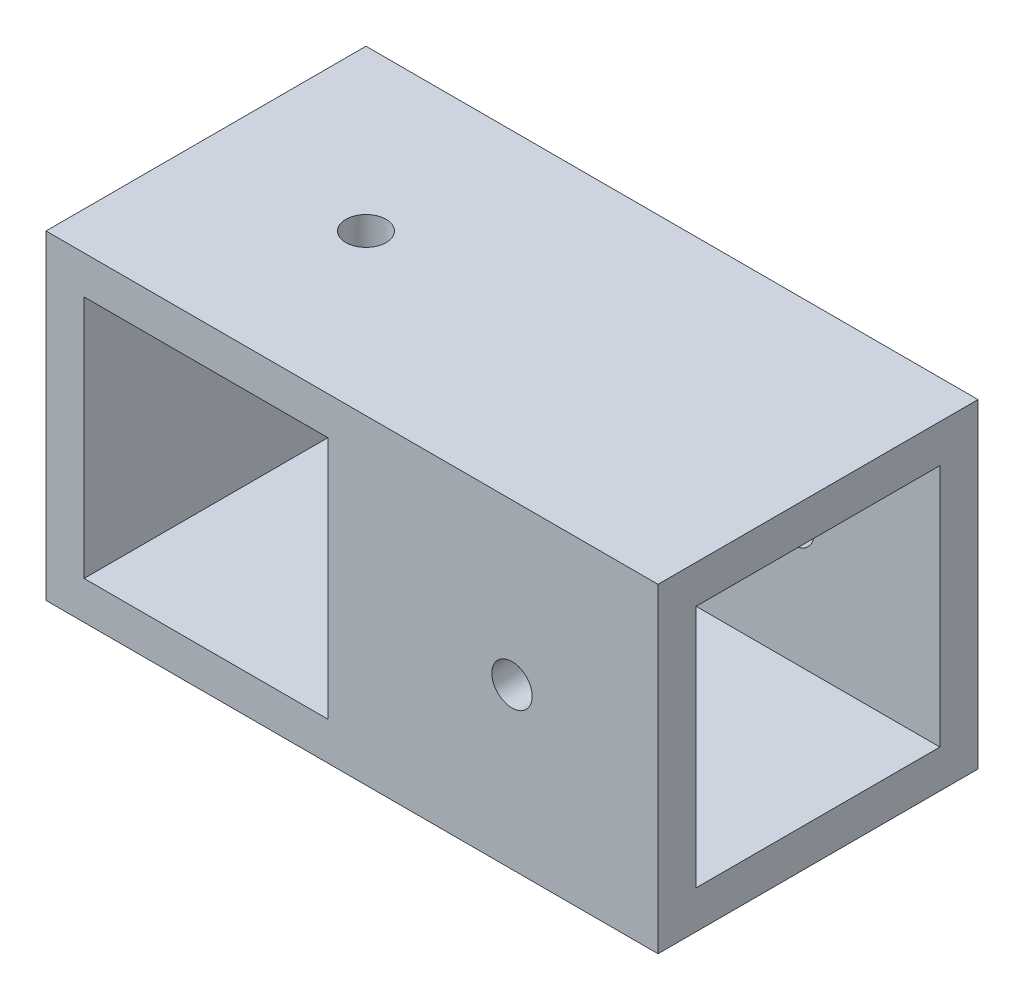
ISO-10303-21;
HEADER;
FILE_DESCRIPTION(('STEP AP214'),'2;1');
FILE_NAME('part.step','',(''),(''),'','','');
FILE_SCHEMA(('AUTOMOTIVE_DESIGN { 1 0 10303 214 1 1 1 1 }'));
ENDSEC;
DATA;
#1=APPLICATION_CONTEXT('core data for automotive mechanical design processes');
#2=APPLICATION_PROTOCOL_DEFINITION('international standard','automotive_design',2000,#1);
#3=PRODUCT_CONTEXT('',#1,'mechanical');
#4=PRODUCT('Part','Part','',(#3));
#5=PRODUCT_RELATED_PRODUCT_CATEGORY('part','',(#4));
#6=PRODUCT_DEFINITION_FORMATION('','',#4);
#7=PRODUCT_DEFINITION_CONTEXT('part definition',#1,'design');
#8=PRODUCT_DEFINITION('design','',#6,#7);
#9=PRODUCT_DEFINITION_SHAPE('','',#8);
#10=(LENGTH_UNIT() NAMED_UNIT(*) SI_UNIT(.MILLI.,.METRE.));
#11=(NAMED_UNIT(*) PLANE_ANGLE_UNIT() SI_UNIT($,.RADIAN.));
#12=(NAMED_UNIT(*) SI_UNIT($,.STERADIAN.) SOLID_ANGLE_UNIT());
#13=UNCERTAINTY_MEASURE_WITH_UNIT(LENGTH_MEASURE(1.E-05),#10,'distance_accuracy_value','');
#14=(GEOMETRIC_REPRESENTATION_CONTEXT(3) GLOBAL_UNCERTAINTY_ASSIGNED_CONTEXT((#13)) GLOBAL_UNIT_ASSIGNED_CONTEXT((#10,
#11,#12)) REPRESENTATION_CONTEXT('',''));
#15=CARTESIAN_POINT('',(0.,0.,0.));
#16=DIRECTION('',(0.,0.,1.));
#17=DIRECTION('',(1.,0.,0.));
#18=AXIS2_PLACEMENT_3D('',#15,#16,#17);
#19=CARTESIAN_POINT('',(0.,0.,25.2));
#20=DIRECTION('',(0.,0.,1.));
#21=DIRECTION('',(1.,0.,0.));
#22=AXIS2_PLACEMENT_3D('',#19,#20,#21);
#23=PLANE('',#22);
#24=CARTESIAN_POINT('',(24.1,0.,25.2));
#25=DIRECTION('',(0.,0.,1.));
#26=DIRECTION('',(1.,0.,0.));
#27=AXIS2_PLACEMENT_3D('',#24,#25,#26);
#28=CIRCLE('',#27,1.5875);
#29=CARTESIAN_POINT('',(25.6875,0.,25.2));
#30=VERTEX_POINT('',#29);
#31=EDGE_CURVE('E286',#30,#30,#28,.T.);
#32=ORIENTED_EDGE('',*,*,#31,.F.);
#33=EDGE_LOOP('',(#32));
#34=FACE_BOUND('',#33,.T.);
#35=DIRECTION('',(0.,-1.,0.));
#36=VECTOR('',#35,1.);
#37=CARTESIAN_POINT('',(-12.6,12.6,25.2));
#38=LINE('',#37,#36);
#39=CARTESIAN_POINT('',(-12.6,12.6,25.2));
#40=VERTEX_POINT('',#39);
#41=CARTESIAN_POINT('',(-12.6,-12.6,25.2));
#42=VERTEX_POINT('',#41);
#43=EDGE_CURVE('E243',#40,#42,#38,.T.);
#44=ORIENTED_EDGE('',*,*,#43,.T.);
#45=DIRECTION('',(1.,0.,0.));
#46=VECTOR('',#45,1.);
#47=CARTESIAN_POINT('',(-12.6,-12.6,25.2));
#48=LINE('',#47,#46);
#49=CARTESIAN_POINT('',(35.6,-12.6,25.2));
#50=VERTEX_POINT('',#49);
#51=EDGE_CURVE('E247',#42,#50,#48,.T.);
#52=ORIENTED_EDGE('',*,*,#51,.T.);
#53=DIRECTION('',(0.,-1.,0.));
#54=VECTOR('',#53,1.);
#55=CARTESIAN_POINT('',(35.6,12.6,25.2));
#56=LINE('',#55,#54);
#57=CARTESIAN_POINT('',(35.6,12.6,25.2));
#58=VERTEX_POINT('',#57);
#59=EDGE_CURVE('E150',#58,#50,#56,.T.);
#60=ORIENTED_EDGE('',*,*,#59,.F.);
#61=DIRECTION('',(-1.,0.,0.));
#62=VECTOR('',#61,1.);
#63=CARTESIAN_POINT('',(-12.6,12.6,25.2));
#64=LINE('',#63,#62);
#65=EDGE_CURVE('E251',#58,#40,#64,.T.);
#66=ORIENTED_EDGE('',*,*,#65,.T.);
#67=EDGE_LOOP('',(#44,#52,#60,#66));
#68=FACE_BOUND('',#67,.T.);
#69=DIRECTION('',(-1.,0.,0.));
#70=VECTOR('',#69,1.);
#71=CARTESIAN_POINT('',(-9.6,9.6,25.2));
#72=LINE('',#71,#70);
#73=CARTESIAN_POINT('',(9.6,9.6,25.2));
#74=VERTEX_POINT('',#73);
#75=CARTESIAN_POINT('',(-9.6,9.6,25.2));
#76=VERTEX_POINT('',#75);
#77=EDGE_CURVE('E205',#74,#76,#72,.T.);
#78=ORIENTED_EDGE('',*,*,#77,.F.);
#79=DIRECTION('',(0.,1.,0.));
#80=VECTOR('',#79,1.);
#81=CARTESIAN_POINT('',(9.6,9.6,25.2));
#82=LINE('',#81,#80);
#83=CARTESIAN_POINT('',(9.6,-9.6,25.2));
#84=VERTEX_POINT('',#83);
#85=EDGE_CURVE('E202',#84,#74,#82,.T.);
#86=ORIENTED_EDGE('',*,*,#85,.F.);
#87=DIRECTION('',(1.,0.,0.));
#88=VECTOR('',#87,1.);
#89=CARTESIAN_POINT('',(-9.6,-9.6,25.2));
#90=LINE('',#89,#88);
#91=CARTESIAN_POINT('',(-9.6,-9.6,25.2));
#92=VERTEX_POINT('',#91);
#93=EDGE_CURVE('E212',#92,#84,#90,.T.);
#94=ORIENTED_EDGE('',*,*,#93,.F.);
#95=DIRECTION('',(0.,-1.,0.));
#96=VECTOR('',#95,1.);
#97=CARTESIAN_POINT('',(-9.6,9.6,25.2));
#98=LINE('',#97,#96);
#99=EDGE_CURVE('E209',#76,#92,#98,.T.);
#100=ORIENTED_EDGE('',*,*,#99,.F.);
#101=EDGE_LOOP('',(#78,#86,#94,#100));
#102=FACE_BOUND('',#101,.T.);
#103=ADVANCED_FACE('F39',(#34,#68,#102),#23,.T.);
#104=CARTESIAN_POINT('',(0.,0.,0.));
#105=DIRECTION('',(0.,0.,1.));
#106=DIRECTION('',(1.,0.,0.));
#107=AXIS2_PLACEMENT_3D('',#104,#105,#106);
#108=PLANE('',#107);
#109=CARTESIAN_POINT('',(24.1,0.,0.));
#110=DIRECTION('',(0.,0.,1.));
#111=DIRECTION('',(1.,0.,0.));
#112=AXIS2_PLACEMENT_3D('',#109,#110,#111);
#113=CIRCLE('',#112,1.5875);
#114=CARTESIAN_POINT('',(25.6875,0.,0.));
#115=VERTEX_POINT('',#114);
#116=EDGE_CURVE('E290',#115,#115,#113,.T.);
#117=ORIENTED_EDGE('',*,*,#116,.T.);
#118=EDGE_LOOP('',(#117));
#119=FACE_BOUND('',#118,.T.);
#120=DIRECTION('',(0.,-1.,0.));
#121=VECTOR('',#120,1.);
#122=CARTESIAN_POINT('',(-12.6,12.6,0.));
#123=LINE('',#122,#121);
#124=CARTESIAN_POINT('',(-12.6,12.6,0.));
#125=VERTEX_POINT('',#124);
#126=CARTESIAN_POINT('',(-12.6,-12.6,0.));
#127=VERTEX_POINT('',#126);
#128=EDGE_CURVE('E242',#125,#127,#123,.T.);
#129=ORIENTED_EDGE('',*,*,#128,.F.);
#130=DIRECTION('',(-1.,0.,0.));
#131=VECTOR('',#130,1.);
#132=CARTESIAN_POINT('',(-12.6,12.6,0.));
#133=LINE('',#132,#131);
#134=CARTESIAN_POINT('',(35.6,12.6,0.));
#135=VERTEX_POINT('',#134);
#136=EDGE_CURVE('E248',#135,#125,#133,.T.);
#137=ORIENTED_EDGE('',*,*,#136,.F.);
#138=DIRECTION('',(0.,1.,0.));
#139=VECTOR('',#138,1.);
#140=CARTESIAN_POINT('',(35.6,12.6,0.));
#141=LINE('',#140,#139);
#142=CARTESIAN_POINT('',(35.6,-12.6,0.));
#143=VERTEX_POINT('',#142);
#144=EDGE_CURVE('E193',#143,#135,#141,.T.);
#145=ORIENTED_EDGE('',*,*,#144,.F.);
#146=DIRECTION('',(1.,0.,0.));
#147=VECTOR('',#146,1.);
#148=CARTESIAN_POINT('',(-12.6,-12.6,0.));
#149=LINE('',#148,#147);
#150=EDGE_CURVE('E257',#127,#143,#149,.T.);
#151=ORIENTED_EDGE('',*,*,#150,.F.);
#152=EDGE_LOOP('',(#129,#137,#145,#151));
#153=FACE_BOUND('',#152,.T.);
#154=DIRECTION('',(0.,1.,0.));
#155=VECTOR('',#154,1.);
#156=CARTESIAN_POINT('',(9.6,9.6,0.));
#157=LINE('',#156,#155);
#158=CARTESIAN_POINT('',(9.6,-9.6,0.));
#159=VERTEX_POINT('',#158);
#160=CARTESIAN_POINT('',(9.6,9.6,0.));
#161=VERTEX_POINT('',#160);
#162=EDGE_CURVE('E201',#159,#161,#157,.T.);
#163=ORIENTED_EDGE('',*,*,#162,.T.);
#164=DIRECTION('',(-1.,0.,0.));
#165=VECTOR('',#164,1.);
#166=CARTESIAN_POINT('',(-9.6,9.6,0.));
#167=LINE('',#166,#165);
#168=CARTESIAN_POINT('',(-9.6,9.6,0.));
#169=VERTEX_POINT('',#168);
#170=EDGE_CURVE('E219',#161,#169,#167,.T.);
#171=ORIENTED_EDGE('',*,*,#170,.T.);
#172=DIRECTION('',(0.,-1.,0.));
#173=VECTOR('',#172,1.);
#174=CARTESIAN_POINT('',(-9.6,9.6,0.));
#175=LINE('',#174,#173);
#176=CARTESIAN_POINT('',(-9.6,-9.6,0.));
#177=VERTEX_POINT('',#176);
#178=EDGE_CURVE('E223',#169,#177,#175,.T.);
#179=ORIENTED_EDGE('',*,*,#178,.T.);
#180=DIRECTION('',(1.,0.,0.));
#181=VECTOR('',#180,1.);
#182=CARTESIAN_POINT('',(-9.6,-9.6,0.));
#183=LINE('',#182,#181);
#184=EDGE_CURVE('E206',#177,#159,#183,.T.);
#185=ORIENTED_EDGE('',*,*,#184,.T.);
#186=EDGE_LOOP('',(#163,#171,#179,#185));
#187=FACE_BOUND('',#186,.T.);
#188=ADVANCED_FACE('F295',(#119,#153,#187),#108,.F.);
#189=CARTESIAN_POINT('',(-12.6,12.6,25.2));
#190=DIRECTION('',(1.,0.,0.));
#191=DIRECTION('',(0.,1.,0.));
#192=AXIS2_PLACEMENT_3D('',#189,#190,#191);
#193=PLANE('',#192);
#194=ORIENTED_EDGE('',*,*,#128,.T.);
#195=DIRECTION('',(0.,0.,-1.));
#196=VECTOR('',#195,1.);
#197=CARTESIAN_POINT('',(-12.6,-12.6,25.2));
#198=LINE('',#197,#196);
#199=EDGE_CURVE('E11',#42,#127,#198,.T.);
#200=ORIENTED_EDGE('',*,*,#199,.F.);
#201=ORIENTED_EDGE('',*,*,#43,.F.);
#202=DIRECTION('',(0.,0.,-1.));
#203=VECTOR('',#202,1.);
#204=CARTESIAN_POINT('',(-12.6,12.6,25.2));
#205=LINE('',#204,#203);
#206=EDGE_CURVE('E49',#40,#125,#205,.T.);
#207=ORIENTED_EDGE('',*,*,#206,.T.);
#208=EDGE_LOOP('',(#194,#200,#201,#207));
#209=FACE_BOUND('',#208,.T.);
#210=ADVANCED_FACE('F41',(#209),#193,.F.);
#211=CARTESIAN_POINT('',(-12.6,-12.6,25.2));
#212=DIRECTION('',(0.,1.,0.));
#213=DIRECTION('',(-1.,0.,0.));
#214=AXIS2_PLACEMENT_3D('',#211,#212,#213);
#215=PLANE('',#214);
#216=CARTESIAN_POINT('',(0.,-12.6,12.6));
#217=DIRECTION('',(0.,1.,0.));
#218=DIRECTION('',(0.,0.,1.));
#219=AXIS2_PLACEMENT_3D('',#216,#217,#218);
#220=CIRCLE('',#219,1.5875);
#221=CARTESIAN_POINT('',(0.,-12.6,14.1875));
#222=VERTEX_POINT('',#221);
#223=EDGE_CURVE('E267',#222,#222,#220,.T.);
#224=ORIENTED_EDGE('',*,*,#223,.T.);
#225=EDGE_LOOP('',(#224));
#226=FACE_BOUND('',#225,.T.);
#227=ORIENTED_EDGE('',*,*,#150,.T.);
#228=DIRECTION('',(0.,0.,-1.));
#229=VECTOR('',#228,1.);
#230=CARTESIAN_POINT('',(35.6,-12.6,25.2));
#231=LINE('',#230,#229);
#232=EDGE_CURVE('E189',#50,#143,#231,.T.);
#233=ORIENTED_EDGE('',*,*,#232,.F.);
#234=ORIENTED_EDGE('',*,*,#51,.F.);
#235=ORIENTED_EDGE('',*,*,#199,.T.);
#236=EDGE_LOOP('',(#227,#233,#234,#235));
#237=FACE_BOUND('',#236,.T.);
#238=ADVANCED_FACE('F329',(#226,#237),#215,.F.);
#239=CARTESIAN_POINT('',(-12.6,12.6,25.2));
#240=DIRECTION('',(0.,-1.,0.));
#241=DIRECTION('',(0.,0.,-1.));
#242=AXIS2_PLACEMENT_3D('',#239,#240,#241);
#243=PLANE('',#242);
#244=CARTESIAN_POINT('',(0.,12.6,12.6));
#245=DIRECTION('',(0.,1.,0.));
#246=DIRECTION('',(0.,0.,1.));
#247=AXIS2_PLACEMENT_3D('',#244,#245,#246);
#248=CIRCLE('',#247,1.5875);
#249=CARTESIAN_POINT('',(0.,12.6,14.1875));
#250=VERTEX_POINT('',#249);
#251=EDGE_CURVE('E274',#250,#250,#248,.T.);
#252=ORIENTED_EDGE('',*,*,#251,.F.);
#253=EDGE_LOOP('',(#252));
#254=FACE_BOUND('',#253,.T.);
#255=ORIENTED_EDGE('',*,*,#136,.T.);
#256=ORIENTED_EDGE('',*,*,#206,.F.);
#257=ORIENTED_EDGE('',*,*,#65,.F.);
#258=DIRECTION('',(0.,0.,1.));
#259=VECTOR('',#258,1.);
#260=CARTESIAN_POINT('',(35.6,12.6,25.2));
#261=LINE('',#260,#259);
#262=EDGE_CURVE('E197',#135,#58,#261,.T.);
#263=ORIENTED_EDGE('',*,*,#262,.F.);
#264=EDGE_LOOP('',(#255,#256,#257,#263));
#265=FACE_BOUND('',#264,.T.);
#266=ADVANCED_FACE('F326',(#254,#265),#243,.F.);
#267=CARTESIAN_POINT('',(9.6,9.6,25.2));
#268=DIRECTION('',(-1.,0.,0.));
#269=DIRECTION('',(0.,-1.,0.));
#270=AXIS2_PLACEMENT_3D('',#267,#268,#269);
#271=PLANE('',#270);
#272=ORIENTED_EDGE('',*,*,#162,.F.);
#273=DIRECTION('',(0.,0.,-1.));
#274=VECTOR('',#273,1.);
#275=CARTESIAN_POINT('',(9.6,-9.6,25.2));
#276=LINE('',#275,#274);
#277=EDGE_CURVE('E215',#84,#159,#276,.T.);
#278=ORIENTED_EDGE('',*,*,#277,.F.);
#279=ORIENTED_EDGE('',*,*,#85,.T.);
#280=DIRECTION('',(0.,0.,-1.));
#281=VECTOR('',#280,1.);
#282=CARTESIAN_POINT('',(9.6,9.6,25.2));
#283=LINE('',#282,#281);
#284=EDGE_CURVE('E238',#74,#161,#283,.T.);
#285=ORIENTED_EDGE('',*,*,#284,.T.);
#286=EDGE_LOOP('',(#272,#278,#279,#285));
#287=FACE_BOUND('',#286,.T.);
#288=ADVANCED_FACE('F323',(#287),#271,.T.);
#289=CARTESIAN_POINT('',(-9.6,9.6,25.2));
#290=DIRECTION('',(0.,-1.,0.));
#291=DIRECTION('',(0.,0.,-1.));
#292=AXIS2_PLACEMENT_3D('',#289,#290,#291);
#293=PLANE('',#292);
#294=CARTESIAN_POINT('',(0.,9.6,12.6));
#295=DIRECTION('',(0.,-1.,0.));
#296=DIRECTION('',(0.,0.,-1.));
#297=AXIS2_PLACEMENT_3D('',#294,#295,#296);
#298=CIRCLE('',#297,1.5875);
#299=CARTESIAN_POINT('',(0.,9.6,11.0125));
#300=VERTEX_POINT('',#299);
#301=EDGE_CURVE('E169',#300,#300,#298,.T.);
#302=ORIENTED_EDGE('',*,*,#301,.F.);
#303=EDGE_LOOP('',(#302));
#304=FACE_BOUND('',#303,.T.);
#305=ORIENTED_EDGE('',*,*,#170,.F.);
#306=ORIENTED_EDGE('',*,*,#284,.F.);
#307=ORIENTED_EDGE('',*,*,#77,.T.);
#308=DIRECTION('',(0.,0.,-1.));
#309=VECTOR('',#308,1.);
#310=CARTESIAN_POINT('',(-9.6,9.6,25.2));
#311=LINE('',#310,#309);
#312=EDGE_CURVE('E235',#76,#169,#311,.T.);
#313=ORIENTED_EDGE('',*,*,#312,.T.);
#314=EDGE_LOOP('',(#305,#306,#307,#313));
#315=FACE_BOUND('',#314,.T.);
#316=ADVANCED_FACE('F360',(#304,#315),#293,.T.);
#317=CARTESIAN_POINT('',(-9.6,9.6,25.2));
#318=DIRECTION('',(1.,0.,0.));
#319=DIRECTION('',(0.,1.,0.));
#320=AXIS2_PLACEMENT_3D('',#317,#318,#319);
#321=PLANE('',#320);
#322=ORIENTED_EDGE('',*,*,#178,.F.);
#323=ORIENTED_EDGE('',*,*,#312,.F.);
#324=ORIENTED_EDGE('',*,*,#99,.T.);
#325=DIRECTION('',(0.,0.,-1.));
#326=VECTOR('',#325,1.);
#327=CARTESIAN_POINT('',(-9.6,-9.6,25.2));
#328=LINE('',#327,#326);
#329=EDGE_CURVE('E65',#92,#177,#328,.T.);
#330=ORIENTED_EDGE('',*,*,#329,.T.);
#331=EDGE_LOOP('',(#322,#323,#324,#330));
#332=FACE_BOUND('',#331,.T.);
#333=ADVANCED_FACE('F363',(#332),#321,.T.);
#334=CARTESIAN_POINT('',(-9.6,-9.6,25.2));
#335=DIRECTION('',(0.,1.,0.));
#336=DIRECTION('',(0.,0.,1.));
#337=AXIS2_PLACEMENT_3D('',#334,#335,#336);
#338=PLANE('',#337);
#339=CARTESIAN_POINT('',(0.,-9.6,12.6));
#340=DIRECTION('',(0.,1.,0.));
#341=DIRECTION('',(0.,0.,1.));
#342=AXIS2_PLACEMENT_3D('',#339,#340,#341);
#343=CIRCLE('',#342,1.5875);
#344=CARTESIAN_POINT('',(0.,-9.6,14.1875));
#345=VERTEX_POINT('',#344);
#346=EDGE_CURVE('E264',#345,#345,#343,.T.);
#347=ORIENTED_EDGE('',*,*,#346,.F.);
#348=EDGE_LOOP('',(#347));
#349=FACE_BOUND('',#348,.T.);
#350=ORIENTED_EDGE('',*,*,#184,.F.);
#351=ORIENTED_EDGE('',*,*,#329,.F.);
#352=ORIENTED_EDGE('',*,*,#93,.T.);
#353=ORIENTED_EDGE('',*,*,#277,.T.);
#354=EDGE_LOOP('',(#350,#351,#352,#353));
#355=FACE_BOUND('',#354,.T.);
#356=ADVANCED_FACE('F366',(#349,#355),#338,.T.);
#357=CARTESIAN_POINT('',(35.6,0.,0.));
#358=DIRECTION('',(1.,0.,0.));
#359=DIRECTION('',(0.,0.,-1.));
#360=AXIS2_PLACEMENT_3D('',#357,#358,#359);
#361=PLANE('',#360);
#362=ORIENTED_EDGE('',*,*,#59,.T.);
#363=ORIENTED_EDGE('',*,*,#232,.T.);
#364=ORIENTED_EDGE('',*,*,#144,.T.);
#365=ORIENTED_EDGE('',*,*,#262,.T.);
#366=EDGE_LOOP('',(#362,#363,#364,#365));
#367=FACE_BOUND('',#366,.T.);
#368=DIRECTION('',(0.,-1.,0.));
#369=VECTOR('',#368,1.);
#370=CARTESIAN_POINT('',(35.6,9.6,22.2));
#371=LINE('',#370,#369);
#372=CARTESIAN_POINT('',(35.6,9.6,22.2));
#373=VERTEX_POINT('',#372);
#374=CARTESIAN_POINT('',(35.6,-9.6,22.2));
#375=VERTEX_POINT('',#374);
#376=EDGE_CURVE('E141',#373,#375,#371,.T.);
#377=ORIENTED_EDGE('',*,*,#376,.F.);
#378=DIRECTION('',(0.,0.,1.));
#379=VECTOR('',#378,1.);
#380=CARTESIAN_POINT('',(35.6,9.6,22.2));
#381=LINE('',#380,#379);
#382=CARTESIAN_POINT('',(35.6,9.6,3.));
#383=VERTEX_POINT('',#382);
#384=EDGE_CURVE('E132',#383,#373,#381,.T.);
#385=ORIENTED_EDGE('',*,*,#384,.F.);
#386=DIRECTION('',(0.,1.,0.));
#387=VECTOR('',#386,1.);
#388=CARTESIAN_POINT('',(35.6,9.6,3.));
#389=LINE('',#388,#387);
#390=CARTESIAN_POINT('',(35.6,-9.6,3.));
#391=VERTEX_POINT('',#390);
#392=EDGE_CURVE('E160',#391,#383,#389,.T.);
#393=ORIENTED_EDGE('',*,*,#392,.F.);
#394=DIRECTION('',(0.,0.,-1.));
#395=VECTOR('',#394,1.);
#396=CARTESIAN_POINT('',(35.6,-9.6,22.2));
#397=LINE('',#396,#395);
#398=EDGE_CURVE('E156',#375,#391,#397,.T.);
#399=ORIENTED_EDGE('',*,*,#398,.F.);
#400=EDGE_LOOP('',(#377,#385,#393,#399));
#401=FACE_BOUND('',#400,.T.);
#402=ADVANCED_FACE('F154',(#367,#401),#361,.T.);
#403=CARTESIAN_POINT('',(35.6,9.6,22.2));
#404=DIRECTION('',(0.,-1.,0.));
#405=DIRECTION('',(0.,0.,-1.));
#406=AXIS2_PLACEMENT_3D('',#403,#404,#405);
#407=PLANE('',#406);
#408=DIRECTION('',(0.,0.,1.));
#409=VECTOR('',#408,1.);
#410=CARTESIAN_POINT('',(12.6,9.6,22.2));
#411=LINE('',#410,#409);
#412=CARTESIAN_POINT('',(12.6,9.6,3.));
#413=VERTEX_POINT('',#412);
#414=CARTESIAN_POINT('',(12.6,9.6,22.2));
#415=VERTEX_POINT('',#414);
#416=EDGE_CURVE('E166',#413,#415,#411,.T.);
#417=ORIENTED_EDGE('',*,*,#416,.F.);
#418=DIRECTION('',(-1.,0.,0.));
#419=VECTOR('',#418,1.);
#420=CARTESIAN_POINT('',(35.6,9.6,3.));
#421=LINE('',#420,#419);
#422=EDGE_CURVE('E57',#383,#413,#421,.T.);
#423=ORIENTED_EDGE('',*,*,#422,.F.);
#424=ORIENTED_EDGE('',*,*,#384,.T.);
#425=DIRECTION('',(-1.,0.,0.));
#426=VECTOR('',#425,1.);
#427=CARTESIAN_POINT('',(35.6,9.6,22.2));
#428=LINE('',#427,#426);
#429=EDGE_CURVE('E135',#373,#415,#428,.T.);
#430=ORIENTED_EDGE('',*,*,#429,.T.);
#431=EDGE_LOOP('',(#417,#423,#424,#430));
#432=FACE_BOUND('',#431,.T.);
#433=ADVANCED_FACE('F134',(#432),#407,.T.);
#434=CARTESIAN_POINT('',(35.6,9.6,22.2));
#435=DIRECTION('',(0.,0.,-1.));
#436=DIRECTION('',(0.,1.,0.));
#437=AXIS2_PLACEMENT_3D('',#434,#435,#436);
#438=PLANE('',#437);
#439=CARTESIAN_POINT('',(24.1,0.,22.2));
#440=DIRECTION('',(0.,0.,-1.));
#441=DIRECTION('',(0.,1.,0.));
#442=AXIS2_PLACEMENT_3D('',#439,#440,#441);
#443=CIRCLE('',#442,1.5875);
#444=CARTESIAN_POINT('',(24.1,1.5875,22.2));
#445=VERTEX_POINT('',#444);
#446=EDGE_CURVE('E280',#445,#445,#443,.F.);
#447=ORIENTED_EDGE('',*,*,#446,.T.);
#448=EDGE_LOOP('',(#447));
#449=FACE_BOUND('',#448,.T.);
#450=DIRECTION('',(0.,-1.,0.));
#451=VECTOR('',#450,1.);
#452=CARTESIAN_POINT('',(12.6,9.6,22.2));
#453=LINE('',#452,#451);
#454=CARTESIAN_POINT('',(12.6,-9.6,22.2));
#455=VERTEX_POINT('',#454);
#456=EDGE_CURVE('E148',#415,#455,#453,.T.);
#457=ORIENTED_EDGE('',*,*,#456,.F.);
#458=ORIENTED_EDGE('',*,*,#429,.F.);
#459=ORIENTED_EDGE('',*,*,#376,.T.);
#460=DIRECTION('',(-1.,0.,0.));
#461=VECTOR('',#460,1.);
#462=CARTESIAN_POINT('',(35.6,-9.6,22.2));
#463=LINE('',#462,#461);
#464=EDGE_CURVE('E151',#375,#455,#463,.T.);
#465=ORIENTED_EDGE('',*,*,#464,.T.);
#466=EDGE_LOOP('',(#457,#458,#459,#465));
#467=FACE_BOUND('',#466,.T.);
#468=ADVANCED_FACE('F145',(#449,#467),#438,.T.);
#469=CARTESIAN_POINT('',(35.6,-9.6,22.2));
#470=DIRECTION('',(0.,1.,0.));
#471=DIRECTION('',(0.,0.,1.));
#472=AXIS2_PLACEMENT_3D('',#469,#470,#471);
#473=PLANE('',#472);
#474=DIRECTION('',(0.,0.,-1.));
#475=VECTOR('',#474,1.);
#476=CARTESIAN_POINT('',(12.6,-9.6,22.2));
#477=LINE('',#476,#475);
#478=CARTESIAN_POINT('',(12.6,-9.6,3.));
#479=VERTEX_POINT('',#478);
#480=EDGE_CURVE('E172',#455,#479,#477,.T.);
#481=ORIENTED_EDGE('',*,*,#480,.F.);
#482=ORIENTED_EDGE('',*,*,#464,.F.);
#483=ORIENTED_EDGE('',*,*,#398,.T.);
#484=DIRECTION('',(-1.,0.,0.));
#485=VECTOR('',#484,1.);
#486=CARTESIAN_POINT('',(35.6,-9.6,3.));
#487=LINE('',#486,#485);
#488=EDGE_CURVE('E181',#391,#479,#487,.T.);
#489=ORIENTED_EDGE('',*,*,#488,.T.);
#490=EDGE_LOOP('',(#481,#482,#483,#489));
#491=FACE_BOUND('',#490,.T.);
#492=ADVANCED_FACE('F443',(#491),#473,.T.);
#493=CARTESIAN_POINT('',(35.6,9.6,3.));
#494=DIRECTION('',(0.,0.,1.));
#495=DIRECTION('',(0.,-1.,0.));
#496=AXIS2_PLACEMENT_3D('',#493,#494,#495);
#497=PLANE('',#496);
#498=CARTESIAN_POINT('',(24.1,0.,3.));
#499=DIRECTION('',(0.,0.,1.));
#500=DIRECTION('',(0.,-1.,0.));
#501=AXIS2_PLACEMENT_3D('',#498,#499,#500);
#502=CIRCLE('',#501,1.5875);
#503=CARTESIAN_POINT('',(24.1,-1.5875,3.));
#504=VERTEX_POINT('',#503);
#505=EDGE_CURVE('E43',#504,#504,#502,.F.);
#506=ORIENTED_EDGE('',*,*,#505,.T.);
#507=EDGE_LOOP('',(#506));
#508=FACE_BOUND('',#507,.T.);
#509=DIRECTION('',(0.,1.,0.));
#510=VECTOR('',#509,1.);
#511=CARTESIAN_POINT('',(12.6,9.6,3.));
#512=LINE('',#511,#510);
#513=EDGE_CURVE('E142',#479,#413,#512,.T.);
#514=ORIENTED_EDGE('',*,*,#513,.F.);
#515=ORIENTED_EDGE('',*,*,#488,.F.);
#516=ORIENTED_EDGE('',*,*,#392,.T.);
#517=ORIENTED_EDGE('',*,*,#422,.T.);
#518=EDGE_LOOP('',(#514,#515,#516,#517));
#519=FACE_BOUND('',#518,.T.);
#520=ADVANCED_FACE('F333',(#508,#519),#497,.T.);
#521=CARTESIAN_POINT('',(12.6,12.6,25.2));
#522=DIRECTION('',(-1.,0.,0.));
#523=DIRECTION('',(0.,-1.,0.));
#524=AXIS2_PLACEMENT_3D('',#521,#522,#523);
#525=PLANE('',#524);
#526=ORIENTED_EDGE('',*,*,#513,.T.);
#527=ORIENTED_EDGE('',*,*,#416,.T.);
#528=ORIENTED_EDGE('',*,*,#456,.T.);
#529=ORIENTED_EDGE('',*,*,#480,.T.);
#530=EDGE_LOOP('',(#526,#527,#528,#529));
#531=FACE_BOUND('',#530,.T.);
#532=ADVANCED_FACE('F331',(#531),#525,.F.);
#533=CARTESIAN_POINT('',(0.,-12.6,12.6));
#534=DIRECTION('',(0.,1.,0.));
#535=DIRECTION('',(0.,0.,1.));
#536=AXIS2_PLACEMENT_3D('',#533,#534,#535);
#537=CYLINDRICAL_SURFACE('',#536,1.5875);
#538=ORIENTED_EDGE('',*,*,#346,.T.);
#539=EDGE_LOOP('',(#538));
#540=FACE_BOUND('',#539,.T.);
#541=ORIENTED_EDGE('',*,*,#223,.F.);
#542=EDGE_LOOP('',(#541));
#543=FACE_BOUND('',#542,.T.);
#544=ADVANCED_FACE('F309',(#540,#543),#537,.F.);
#545=ORIENTED_EDGE('',*,*,#301,.T.);
#546=EDGE_LOOP('',(#545));
#547=FACE_BOUND('',#546,.T.);
#548=ORIENTED_EDGE('',*,*,#251,.T.);
#549=EDGE_LOOP('',(#548));
#550=FACE_BOUND('',#549,.T.);
#551=ADVANCED_FACE('F301',(#547,#550),#537,.F.);
#552=CARTESIAN_POINT('',(24.1,0.,25.2));
#553=DIRECTION('',(0.,0.,-1.));
#554=DIRECTION('',(-1.,0.,0.));
#555=AXIS2_PLACEMENT_3D('',#552,#553,#554);
#556=CYLINDRICAL_SURFACE('',#555,1.5875);
#557=ORIENTED_EDGE('',*,*,#505,.F.);
#558=EDGE_LOOP('',(#557));
#559=FACE_BOUND('',#558,.T.);
#560=ORIENTED_EDGE('',*,*,#116,.F.);
#561=EDGE_LOOP('',(#560));
#562=FACE_BOUND('',#561,.T.);
#563=ADVANCED_FACE('F298',(#559,#562),#556,.F.);
#564=ORIENTED_EDGE('',*,*,#446,.F.);
#565=EDGE_LOOP('',(#564));
#566=FACE_BOUND('',#565,.T.);
#567=ORIENTED_EDGE('',*,*,#31,.T.);
#568=EDGE_LOOP('',(#567));
#569=FACE_BOUND('',#568,.T.);
#570=ADVANCED_FACE('F300',(#566,#569),#556,.F.);
#571=CLOSED_SHELL('',(#103,#188,#210,#238,#266,#288,#316,#333,#356,#402,#433,#468,#492,#520,
#532,#544,#551,#563,#570));
#572=MANIFOLD_SOLID_BREP('B2',#571);
#573=ADVANCED_BREP_SHAPE_REPRESENTATION('',(#18,#572),#14);
#574=SHAPE_DEFINITION_REPRESENTATION(#9,#573);
ENDSEC;
END-ISO-10303-21;
